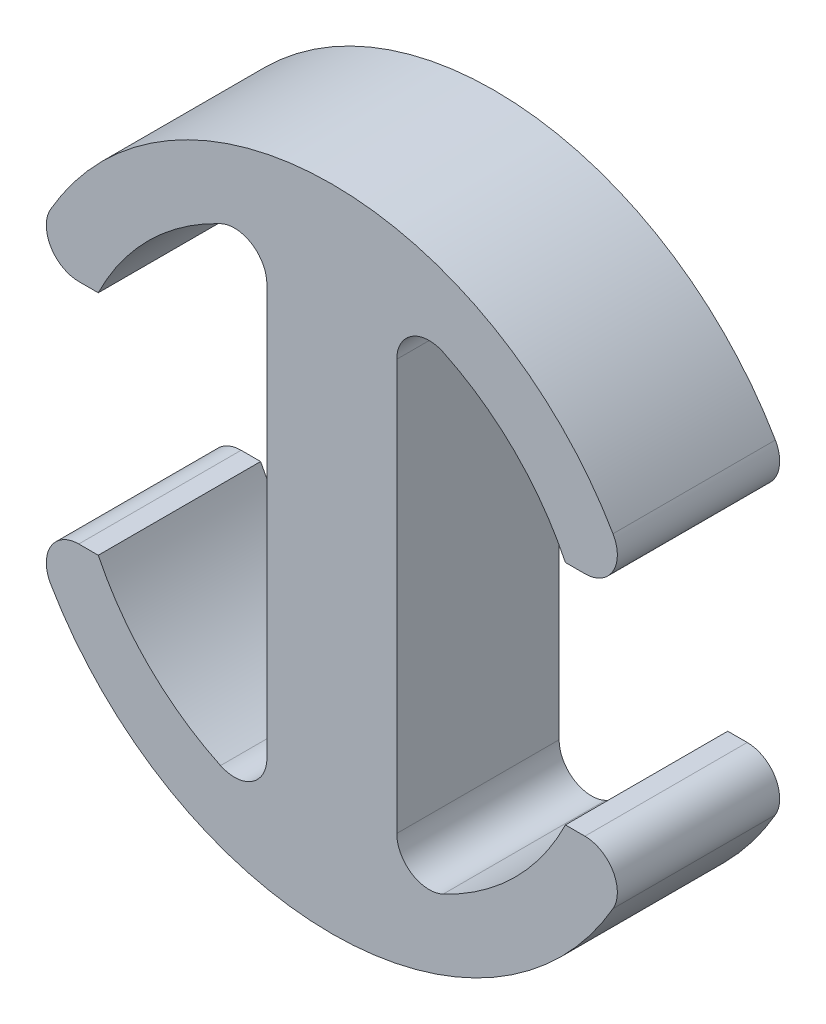
ISO-10303-21;
HEADER;
FILE_DESCRIPTION(('STEP AP214'),'2;1');
FILE_NAME('part.step','',(''),(''),'','','');
FILE_SCHEMA(('AUTOMOTIVE_DESIGN { 1 0 10303 214 1 1 1 1 }'));
ENDSEC;
DATA;
#1=APPLICATION_CONTEXT('core data for automotive mechanical design processes');
#2=APPLICATION_PROTOCOL_DEFINITION('international standard','automotive_design',2000,#1);
#3=PRODUCT_CONTEXT('',#1,'mechanical');
#4=PRODUCT('Part','Part','',(#3));
#5=PRODUCT_RELATED_PRODUCT_CATEGORY('part','',(#4));
#6=PRODUCT_DEFINITION_FORMATION('','',#4);
#7=PRODUCT_DEFINITION_CONTEXT('part definition',#1,'design');
#8=PRODUCT_DEFINITION('design','',#6,#7);
#9=PRODUCT_DEFINITION_SHAPE('','',#8);
#10=(LENGTH_UNIT() NAMED_UNIT(*) SI_UNIT(.MILLI.,.METRE.));
#11=(NAMED_UNIT(*) PLANE_ANGLE_UNIT() SI_UNIT($,.RADIAN.));
#12=(NAMED_UNIT(*) SI_UNIT($,.STERADIAN.) SOLID_ANGLE_UNIT());
#13=UNCERTAINTY_MEASURE_WITH_UNIT(LENGTH_MEASURE(1.E-05),#10,'distance_accuracy_value','');
#14=(GEOMETRIC_REPRESENTATION_CONTEXT(3) GLOBAL_UNCERTAINTY_ASSIGNED_CONTEXT((#13)) GLOBAL_UNIT_ASSIGNED_CONTEXT((#10,
#11,#12)) REPRESENTATION_CONTEXT('',''));
#15=CARTESIAN_POINT('',(0.,0.,0.));
#16=DIRECTION('',(0.,0.,1.));
#17=DIRECTION('',(1.,0.,0.));
#18=AXIS2_PLACEMENT_3D('',#15,#16,#17);
#19=CARTESIAN_POINT('',(-3.,6.32455532033676,5.));
#20=DIRECTION('',(0.,0.,-1.));
#21=DIRECTION('',(-1.,0.,0.));
#22=AXIS2_PLACEMENT_3D('',#19,#20,#21);
#23=CYLINDRICAL_SURFACE('',#22,1.);
#24=CARTESIAN_POINT('',(-3.,6.32455532033676,0.));
#25=DIRECTION('',(0.,0.,1.));
#26=DIRECTION('',(1.,0.,0.));
#27=AXIS2_PLACEMENT_3D('',#24,#25,#26);
#28=CIRCLE('',#27,1.);
#29=CARTESIAN_POINT('',(-2.,6.32455532033676,0.));
#30=VERTEX_POINT('',#29);
#31=CARTESIAN_POINT('',(-3.42857142857143,7.22806322324201,0.));
#32=VERTEX_POINT('',#31);
#33=EDGE_CURVE('E294',#30,#32,#28,.T.);
#34=ORIENTED_EDGE('',*,*,#33,.F.);
#35=DIRECTION('',(0.,0.,-1.));
#36=VECTOR('',#35,1.);
#37=CARTESIAN_POINT('',(-2.,6.32455532033676,5.));
#38=LINE('',#37,#36);
#39=CARTESIAN_POINT('',(-2.,6.32455532033676,5.));
#40=VERTEX_POINT('',#39);
#41=EDGE_CURVE('E12',#40,#30,#38,.T.);
#42=ORIENTED_EDGE('',*,*,#41,.F.);
#43=CARTESIAN_POINT('',(-3.,6.32455532033676,5.));
#44=DIRECTION('',(0.,0.,1.));
#45=DIRECTION('',(1.,0.,0.));
#46=AXIS2_PLACEMENT_3D('',#43,#44,#45);
#47=CIRCLE('',#46,1.);
#48=CARTESIAN_POINT('',(-3.42857142857143,7.22806322324201,5.));
#49=VERTEX_POINT('',#48);
#50=EDGE_CURVE('E286',#40,#49,#47,.T.);
#51=ORIENTED_EDGE('',*,*,#50,.T.);
#52=DIRECTION('',(0.,0.,-1.));
#53=VECTOR('',#52,1.);
#54=CARTESIAN_POINT('',(-3.42857142857143,7.22806322324201,5.));
#55=LINE('',#54,#53);
#56=EDGE_CURVE('E39',#49,#32,#55,.T.);
#57=ORIENTED_EDGE('',*,*,#56,.T.);
#58=EDGE_LOOP('',(#34,#42,#51,#57));
#59=FACE_BOUND('',#58,.T.);
#60=ADVANCED_FACE('F36',(#59),#23,.F.);
#61=CARTESIAN_POINT('',(-2.,-6.32455532033676,5.));
#62=DIRECTION('',(-1.,0.,0.));
#63=DIRECTION('',(0.,0.,1.));
#64=AXIS2_PLACEMENT_3D('',#61,#62,#63);
#65=PLANE('',#64);
#66=DIRECTION('',(0.,1.,0.));
#67=VECTOR('',#66,1.);
#68=CARTESIAN_POINT('',(-2.,-6.32455532033676,0.));
#69=LINE('',#68,#67);
#70=CARTESIAN_POINT('',(-2.,-6.32455532033676,0.));
#71=VERTEX_POINT('',#70);
#72=EDGE_CURVE('E289',#71,#30,#69,.T.);
#73=ORIENTED_EDGE('',*,*,#72,.F.);
#74=DIRECTION('',(0.,0.,-1.));
#75=VECTOR('',#74,1.);
#76=CARTESIAN_POINT('',(-2.,-6.32455532033676,5.));
#77=LINE('',#76,#75);
#78=CARTESIAN_POINT('',(-2.,-6.32455532033676,5.));
#79=VERTEX_POINT('',#78);
#80=EDGE_CURVE('E45',#79,#71,#77,.T.);
#81=ORIENTED_EDGE('',*,*,#80,.F.);
#82=DIRECTION('',(0.,1.,0.));
#83=VECTOR('',#82,1.);
#84=CARTESIAN_POINT('',(-2.,-6.32455532033676,5.));
#85=LINE('',#84,#83);
#86=EDGE_CURVE('E185',#79,#40,#85,.T.);
#87=ORIENTED_EDGE('',*,*,#86,.T.);
#88=ORIENTED_EDGE('',*,*,#41,.T.);
#89=EDGE_LOOP('',(#73,#81,#87,#88));
#90=FACE_BOUND('',#89,.T.);
#91=ADVANCED_FACE('F385',(#90),#65,.T.);
#92=CARTESIAN_POINT('',(-3.,-6.32455532033676,5.));
#93=DIRECTION('',(0.,0.,-1.));
#94=DIRECTION('',(-1.,0.,0.));
#95=AXIS2_PLACEMENT_3D('',#92,#93,#94);
#96=CYLINDRICAL_SURFACE('',#95,1.);
#97=CARTESIAN_POINT('',(-3.,-6.32455532033676,0.));
#98=DIRECTION('',(0.,0.,-1.));
#99=DIRECTION('',(-1.,0.,0.));
#100=AXIS2_PLACEMENT_3D('',#97,#98,#99);
#101=CIRCLE('',#100,1.);
#102=CARTESIAN_POINT('',(-3.42857142857143,-7.22806322324201,0.));
#103=VERTEX_POINT('',#102);
#104=EDGE_CURVE('E190',#71,#103,#101,.T.);
#105=ORIENTED_EDGE('',*,*,#104,.T.);
#106=DIRECTION('',(0.,0.,-1.));
#107=VECTOR('',#106,1.);
#108=CARTESIAN_POINT('',(-3.42857142857143,-7.22806322324201,5.));
#109=LINE('',#108,#107);
#110=CARTESIAN_POINT('',(-3.42857142857143,-7.22806322324201,5.));
#111=VERTEX_POINT('',#110);
#112=EDGE_CURVE('E188',#111,#103,#109,.T.);
#113=ORIENTED_EDGE('',*,*,#112,.F.);
#114=CARTESIAN_POINT('',(-3.,-6.32455532033676,5.));
#115=DIRECTION('',(0.,0.,-1.));
#116=DIRECTION('',(-1.,0.,0.));
#117=AXIS2_PLACEMENT_3D('',#114,#115,#116);
#118=CIRCLE('',#117,1.);
#119=EDGE_CURVE('E180',#79,#111,#118,.T.);
#120=ORIENTED_EDGE('',*,*,#119,.F.);
#121=ORIENTED_EDGE('',*,*,#80,.T.);
#122=EDGE_LOOP('',(#105,#113,#120,#121));
#123=FACE_BOUND('',#122,.T.);
#124=ADVANCED_FACE('F189',(#123),#96,.F.);
#125=CARTESIAN_POINT('',(0.,0.,5.));
#126=DIRECTION('',(0.,0.,-1.));
#127=DIRECTION('',(-1.,0.,0.));
#128=AXIS2_PLACEMENT_3D('',#125,#126,#127);
#129=CYLINDRICAL_SURFACE('',#128,8.);
#130=CARTESIAN_POINT('',(0.,0.,0.));
#131=DIRECTION('',(0.,0.,1.));
#132=DIRECTION('',(1.,0.,0.));
#133=AXIS2_PLACEMENT_3D('',#130,#131,#132);
#134=CIRCLE('',#133,8.);
#135=CARTESIAN_POINT('',(-7.19374728496908,-3.5,0.));
#136=VERTEX_POINT('',#135);
#137=EDGE_CURVE('E341',#136,#103,#134,.T.);
#138=ORIENTED_EDGE('',*,*,#137,.F.);
#139=DIRECTION('',(0.,0.,-1.));
#140=VECTOR('',#139,1.);
#141=CARTESIAN_POINT('',(-7.19374728496908,-3.5,5.));
#142=LINE('',#141,#140);
#143=CARTESIAN_POINT('',(-7.19374728496908,-3.5,5.));
#144=VERTEX_POINT('',#143);
#145=EDGE_CURVE('E194',#144,#136,#142,.T.);
#146=ORIENTED_EDGE('',*,*,#145,.F.);
#147=CARTESIAN_POINT('',(0.,0.,5.));
#148=DIRECTION('',(0.,0.,1.));
#149=DIRECTION('',(1.,0.,0.));
#150=AXIS2_PLACEMENT_3D('',#147,#148,#149);
#151=CIRCLE('',#150,8.);
#152=EDGE_CURVE('E184',#144,#111,#151,.T.);
#153=ORIENTED_EDGE('',*,*,#152,.T.);
#154=ORIENTED_EDGE('',*,*,#112,.T.);
#155=EDGE_LOOP('',(#138,#146,#153,#154));
#156=FACE_BOUND('',#155,.T.);
#157=ADVANCED_FACE('F196',(#156),#129,.F.);
#158=CARTESIAN_POINT('',(-7.19374728496908,-3.5,5.));
#159=DIRECTION('',(0.,-1.,0.));
#160=DIRECTION('',(1.,0.,0.));
#161=AXIS2_PLACEMENT_3D('',#158,#159,#160);
#162=PLANE('',#161);
#163=DIRECTION('',(-1.,0.,0.));
#164=VECTOR('',#163,1.);
#165=CARTESIAN_POINT('',(-7.19374728496908,-3.5,0.));
#166=LINE('',#165,#164);
#167=CARTESIAN_POINT('',(-7.79422863405995,-3.5,0.));
#168=VERTEX_POINT('',#167);
#169=EDGE_CURVE('E339',#136,#168,#166,.T.);
#170=ORIENTED_EDGE('',*,*,#169,.T.);
#171=DIRECTION('',(0.,0.,-1.));
#172=VECTOR('',#171,1.);
#173=CARTESIAN_POINT('',(-7.79422863405995,-3.5,5.));
#174=LINE('',#173,#172);
#175=CARTESIAN_POINT('',(-7.79422863405995,-3.5,5.));
#176=VERTEX_POINT('',#175);
#177=EDGE_CURVE('E348',#176,#168,#174,.T.);
#178=ORIENTED_EDGE('',*,*,#177,.F.);
#179=DIRECTION('',(-1.,0.,0.));
#180=VECTOR('',#179,1.);
#181=CARTESIAN_POINT('',(-7.19374728496908,-3.5,5.));
#182=LINE('',#181,#180);
#183=EDGE_CURVE('E199',#144,#176,#182,.T.);
#184=ORIENTED_EDGE('',*,*,#183,.F.);
#185=ORIENTED_EDGE('',*,*,#145,.T.);
#186=EDGE_LOOP('',(#170,#178,#184,#185));
#187=FACE_BOUND('',#186,.T.);
#188=ADVANCED_FACE('F398',(#187),#162,.F.);
#189=CARTESIAN_POINT('',(-7.79422863405995,-4.5,5.));
#190=DIRECTION('',(0.,0.,-1.));
#191=DIRECTION('',(-1.,0.,0.));
#192=AXIS2_PLACEMENT_3D('',#189,#190,#191);
#193=CYLINDRICAL_SURFACE('',#192,1.);
#194=CARTESIAN_POINT('',(-7.79422863405995,-4.5,0.));
#195=DIRECTION('',(0.,0.,1.));
#196=DIRECTION('',(1.,0.,0.));
#197=AXIS2_PLACEMENT_3D('',#194,#195,#196);
#198=CIRCLE('',#197,1.);
#199=CARTESIAN_POINT('',(-8.66025403784439,-5.,0.));
#200=VERTEX_POINT('',#199);
#201=EDGE_CURVE('E337',#168,#200,#198,.T.);
#202=ORIENTED_EDGE('',*,*,#201,.T.);
#203=DIRECTION('',(0.,0.,-1.));
#204=VECTOR('',#203,1.);
#205=CARTESIAN_POINT('',(-8.66025403784439,-5.,5.));
#206=LINE('',#205,#204);
#207=CARTESIAN_POINT('',(-8.66025403784439,-5.,5.));
#208=VERTEX_POINT('',#207);
#209=EDGE_CURVE('E351',#208,#200,#206,.T.);
#210=ORIENTED_EDGE('',*,*,#209,.F.);
#211=CARTESIAN_POINT('',(-7.79422863405995,-4.5,5.));
#212=DIRECTION('',(0.,0.,1.));
#213=DIRECTION('',(1.,0.,0.));
#214=AXIS2_PLACEMENT_3D('',#211,#212,#213);
#215=CIRCLE('',#214,1.);
#216=EDGE_CURVE('E202',#176,#208,#215,.T.);
#217=ORIENTED_EDGE('',*,*,#216,.F.);
#218=ORIENTED_EDGE('',*,*,#177,.T.);
#219=EDGE_LOOP('',(#202,#210,#217,#218));
#220=FACE_BOUND('',#219,.T.);
#221=ADVANCED_FACE('F401',(#220),#193,.T.);
#222=CARTESIAN_POINT('',(0.,0.,5.));
#223=DIRECTION('',(0.,0.,-1.));
#224=DIRECTION('',(-1.,0.,0.));
#225=AXIS2_PLACEMENT_3D('',#222,#223,#224);
#226=CYLINDRICAL_SURFACE('',#225,10.);
#227=CARTESIAN_POINT('',(0.,0.,0.));
#228=DIRECTION('',(0.,0.,1.));
#229=DIRECTION('',(1.,0.,0.));
#230=AXIS2_PLACEMENT_3D('',#227,#228,#229);
#231=CIRCLE('',#230,10.);
#232=CARTESIAN_POINT('',(8.66025403784439,-5.,0.));
#233=VERTEX_POINT('',#232);
#234=EDGE_CURVE('E335',#200,#233,#231,.T.);
#235=ORIENTED_EDGE('',*,*,#234,.T.);
#236=DIRECTION('',(0.,0.,-1.));
#237=VECTOR('',#236,1.);
#238=CARTESIAN_POINT('',(8.66025403784439,-5.,5.));
#239=LINE('',#238,#237);
#240=CARTESIAN_POINT('',(8.66025403784439,-5.,5.));
#241=VERTEX_POINT('',#240);
#242=EDGE_CURVE('E354',#241,#233,#239,.T.);
#243=ORIENTED_EDGE('',*,*,#242,.F.);
#244=CARTESIAN_POINT('',(0.,0.,5.));
#245=DIRECTION('',(0.,0.,1.));
#246=DIRECTION('',(1.,0.,0.));
#247=AXIS2_PLACEMENT_3D('',#244,#245,#246);
#248=CIRCLE('',#247,10.);
#249=EDGE_CURVE('E219',#208,#241,#248,.T.);
#250=ORIENTED_EDGE('',*,*,#249,.F.);
#251=ORIENTED_EDGE('',*,*,#209,.T.);
#252=EDGE_LOOP('',(#235,#243,#250,#251));
#253=FACE_BOUND('',#252,.T.);
#254=ADVANCED_FACE('F405',(#253),#226,.T.);
#255=CARTESIAN_POINT('',(7.79422863405995,-4.5,5.));
#256=DIRECTION('',(0.,0.,-1.));
#257=DIRECTION('',(-1.,0.,0.));
#258=AXIS2_PLACEMENT_3D('',#255,#256,#257);
#259=CYLINDRICAL_SURFACE('',#258,0.999999999999999);
#260=CARTESIAN_POINT('',(7.79422863405995,-4.5,0.));
#261=DIRECTION('',(0.,0.,1.));
#262=DIRECTION('',(1.,0.,0.));
#263=AXIS2_PLACEMENT_3D('',#260,#261,#262);
#264=CIRCLE('',#263,0.999999999999999);
#265=CARTESIAN_POINT('',(7.79422863405995,-3.5,0.));
#266=VERTEX_POINT('',#265);
#267=EDGE_CURVE('E332',#233,#266,#264,.T.);
#268=ORIENTED_EDGE('',*,*,#267,.T.);
#269=DIRECTION('',(0.,0.,-1.));
#270=VECTOR('',#269,1.);
#271=CARTESIAN_POINT('',(7.79422863405995,-3.5,5.));
#272=LINE('',#271,#270);
#273=CARTESIAN_POINT('',(7.79422863405995,-3.5,5.));
#274=VERTEX_POINT('',#273);
#275=EDGE_CURVE('E357',#274,#266,#272,.T.);
#276=ORIENTED_EDGE('',*,*,#275,.F.);
#277=CARTESIAN_POINT('',(7.79422863405995,-4.5,5.));
#278=DIRECTION('',(0.,0.,1.));
#279=DIRECTION('',(1.,0.,0.));
#280=AXIS2_PLACEMENT_3D('',#277,#278,#279);
#281=CIRCLE('',#280,0.999999999999999);
#282=EDGE_CURVE('E223',#241,#274,#281,.T.);
#283=ORIENTED_EDGE('',*,*,#282,.F.);
#284=ORIENTED_EDGE('',*,*,#242,.T.);
#285=EDGE_LOOP('',(#268,#276,#283,#284));
#286=FACE_BOUND('',#285,.T.);
#287=ADVANCED_FACE('F409',(#286),#259,.T.);
#288=CARTESIAN_POINT('',(7.19374728496908,-3.5,5.));
#289=DIRECTION('',(0.,1.,0.));
#290=DIRECTION('',(-1.,0.,0.));
#291=AXIS2_PLACEMENT_3D('',#288,#289,#290);
#292=PLANE('',#291);
#293=DIRECTION('',(1.,0.,0.));
#294=VECTOR('',#293,1.);
#295=CARTESIAN_POINT('',(7.19374728496908,-3.5,0.));
#296=LINE('',#295,#294);
#297=CARTESIAN_POINT('',(7.19374728496908,-3.5,0.));
#298=VERTEX_POINT('',#297);
#299=EDGE_CURVE('E329',#298,#266,#296,.T.);
#300=ORIENTED_EDGE('',*,*,#299,.F.);
#301=DIRECTION('',(0.,0.,-1.));
#302=VECTOR('',#301,1.);
#303=CARTESIAN_POINT('',(7.19374728496908,-3.5,5.));
#304=LINE('',#303,#302);
#305=CARTESIAN_POINT('',(7.19374728496908,-3.5,5.));
#306=VERTEX_POINT('',#305);
#307=EDGE_CURVE('E359',#306,#298,#304,.T.);
#308=ORIENTED_EDGE('',*,*,#307,.F.);
#309=DIRECTION('',(1.,0.,0.));
#310=VECTOR('',#309,1.);
#311=CARTESIAN_POINT('',(7.19374728496908,-3.5,5.));
#312=LINE('',#311,#310);
#313=EDGE_CURVE('E227',#306,#274,#312,.T.);
#314=ORIENTED_EDGE('',*,*,#313,.T.);
#315=ORIENTED_EDGE('',*,*,#275,.T.);
#316=EDGE_LOOP('',(#300,#308,#314,#315));
#317=FACE_BOUND('',#316,.T.);
#318=ADVANCED_FACE('F413',(#317),#292,.T.);
#319=CARTESIAN_POINT('',(0.,0.,5.));
#320=DIRECTION('',(0.,0.,-1.));
#321=DIRECTION('',(-1.,0.,0.));
#322=AXIS2_PLACEMENT_3D('',#319,#320,#321);
#323=CYLINDRICAL_SURFACE('',#322,8.);
#324=CARTESIAN_POINT('',(0.,0.,0.));
#325=DIRECTION('',(0.,0.,1.));
#326=DIRECTION('',(1.,0.,0.));
#327=AXIS2_PLACEMENT_3D('',#324,#325,#326);
#328=CIRCLE('',#327,8.);
#329=CARTESIAN_POINT('',(3.42857142857143,-7.22806322324201,0.));
#330=VERTEX_POINT('',#329);
#331=EDGE_CURVE('E326',#330,#298,#328,.T.);
#332=ORIENTED_EDGE('',*,*,#331,.F.);
#333=DIRECTION('',(0.,0.,-1.));
#334=VECTOR('',#333,1.);
#335=CARTESIAN_POINT('',(3.42857142857143,-7.22806322324201,5.));
#336=LINE('',#335,#334);
#337=CARTESIAN_POINT('',(3.42857142857143,-7.22806322324201,5.));
#338=VERTEX_POINT('',#337);
#339=EDGE_CURVE('E361',#338,#330,#336,.T.);
#340=ORIENTED_EDGE('',*,*,#339,.F.);
#341=CARTESIAN_POINT('',(0.,0.,5.));
#342=DIRECTION('',(0.,0.,1.));
#343=DIRECTION('',(1.,0.,0.));
#344=AXIS2_PLACEMENT_3D('',#341,#342,#343);
#345=CIRCLE('',#344,8.);
#346=EDGE_CURVE('E235',#338,#306,#345,.T.);
#347=ORIENTED_EDGE('',*,*,#346,.T.);
#348=ORIENTED_EDGE('',*,*,#307,.T.);
#349=EDGE_LOOP('',(#332,#340,#347,#348));
#350=FACE_BOUND('',#349,.T.);
#351=ADVANCED_FACE('F417',(#350),#323,.F.);
#352=CARTESIAN_POINT('',(3.,-6.32455532033676,5.));
#353=DIRECTION('',(0.,0.,-1.));
#354=DIRECTION('',(-1.,0.,0.));
#355=AXIS2_PLACEMENT_3D('',#352,#353,#354);
#356=CYLINDRICAL_SURFACE('',#355,1.);
#357=CARTESIAN_POINT('',(3.,-6.32455532033676,0.));
#358=DIRECTION('',(0.,0.,-1.));
#359=DIRECTION('',(-1.,0.,0.));
#360=AXIS2_PLACEMENT_3D('',#357,#358,#359);
#361=CIRCLE('',#360,1.);
#362=CARTESIAN_POINT('',(2.,-6.32455532033676,0.));
#363=VERTEX_POINT('',#362);
#364=EDGE_CURVE('E324',#330,#363,#361,.T.);
#365=ORIENTED_EDGE('',*,*,#364,.T.);
#366=DIRECTION('',(0.,0.,-1.));
#367=VECTOR('',#366,1.);
#368=CARTESIAN_POINT('',(2.,-6.32455532033676,5.));
#369=LINE('',#368,#367);
#370=CARTESIAN_POINT('',(2.,-6.32455532033676,5.));
#371=VERTEX_POINT('',#370);
#372=EDGE_CURVE('E363',#371,#363,#369,.T.);
#373=ORIENTED_EDGE('',*,*,#372,.F.);
#374=CARTESIAN_POINT('',(3.,-6.32455532033676,5.));
#375=DIRECTION('',(0.,0.,-1.));
#376=DIRECTION('',(-1.,0.,0.));
#377=AXIS2_PLACEMENT_3D('',#374,#375,#376);
#378=CIRCLE('',#377,1.);
#379=EDGE_CURVE('E239',#338,#371,#378,.T.);
#380=ORIENTED_EDGE('',*,*,#379,.F.);
#381=ORIENTED_EDGE('',*,*,#339,.T.);
#382=EDGE_LOOP('',(#365,#373,#380,#381));
#383=FACE_BOUND('',#382,.T.);
#384=ADVANCED_FACE('F421',(#383),#356,.F.);
#385=CARTESIAN_POINT('',(2.,-6.32455532033676,5.));
#386=DIRECTION('',(-1.,0.,0.));
#387=DIRECTION('',(0.,0.,1.));
#388=AXIS2_PLACEMENT_3D('',#385,#386,#387);
#389=PLANE('',#388);
#390=DIRECTION('',(0.,1.,0.));
#391=VECTOR('',#390,1.);
#392=CARTESIAN_POINT('',(2.,-6.32455532033676,0.));
#393=LINE('',#392,#391);
#394=CARTESIAN_POINT('',(2.,6.32455532033676,0.));
#395=VERTEX_POINT('',#394);
#396=EDGE_CURVE('E321',#363,#395,#393,.T.);
#397=ORIENTED_EDGE('',*,*,#396,.T.);
#398=DIRECTION('',(0.,0.,-1.));
#399=VECTOR('',#398,1.);
#400=CARTESIAN_POINT('',(2.,6.32455532033676,5.));
#401=LINE('',#400,#399);
#402=CARTESIAN_POINT('',(2.,6.32455532033676,5.));
#403=VERTEX_POINT('',#402);
#404=EDGE_CURVE('E366',#403,#395,#401,.T.);
#405=ORIENTED_EDGE('',*,*,#404,.F.);
#406=DIRECTION('',(0.,1.,0.));
#407=VECTOR('',#406,1.);
#408=CARTESIAN_POINT('',(2.,-6.32455532033676,5.));
#409=LINE('',#408,#407);
#410=EDGE_CURVE('E243',#371,#403,#409,.T.);
#411=ORIENTED_EDGE('',*,*,#410,.F.);
#412=ORIENTED_EDGE('',*,*,#372,.T.);
#413=EDGE_LOOP('',(#397,#405,#411,#412));
#414=FACE_BOUND('',#413,.T.);
#415=ADVANCED_FACE('F425',(#414),#389,.F.);
#416=CARTESIAN_POINT('',(3.,6.32455532033676,5.));
#417=DIRECTION('',(0.,0.,-1.));
#418=DIRECTION('',(-1.,0.,0.));
#419=AXIS2_PLACEMENT_3D('',#416,#417,#418);
#420=CYLINDRICAL_SURFACE('',#419,1.);
#421=CARTESIAN_POINT('',(3.,6.32455532033676,0.));
#422=DIRECTION('',(0.,0.,1.));
#423=DIRECTION('',(1.,0.,0.));
#424=AXIS2_PLACEMENT_3D('',#421,#422,#423);
#425=CIRCLE('',#424,1.);
#426=CARTESIAN_POINT('',(3.42857142857143,7.22806322324201,0.));
#427=VERTEX_POINT('',#426);
#428=EDGE_CURVE('E318',#427,#395,#425,.T.);
#429=ORIENTED_EDGE('',*,*,#428,.F.);
#430=DIRECTION('',(0.,0.,-1.));
#431=VECTOR('',#430,1.);
#432=CARTESIAN_POINT('',(3.42857142857143,7.22806322324201,5.));
#433=LINE('',#432,#431);
#434=CARTESIAN_POINT('',(3.42857142857143,7.22806322324201,5.));
#435=VERTEX_POINT('',#434);
#436=EDGE_CURVE('E368',#435,#427,#433,.T.);
#437=ORIENTED_EDGE('',*,*,#436,.F.);
#438=CARTESIAN_POINT('',(3.,6.32455532033676,5.));
#439=DIRECTION('',(0.,0.,1.));
#440=DIRECTION('',(1.,0.,0.));
#441=AXIS2_PLACEMENT_3D('',#438,#439,#440);
#442=CIRCLE('',#441,1.);
#443=EDGE_CURVE('E247',#435,#403,#442,.T.);
#444=ORIENTED_EDGE('',*,*,#443,.T.);
#445=ORIENTED_EDGE('',*,*,#404,.T.);
#446=EDGE_LOOP('',(#429,#437,#444,#445));
#447=FACE_BOUND('',#446,.T.);
#448=ADVANCED_FACE('F429',(#447),#420,.F.);
#449=CARTESIAN_POINT('',(0.,0.,5.));
#450=DIRECTION('',(0.,0.,-1.));
#451=DIRECTION('',(-1.,0.,0.));
#452=AXIS2_PLACEMENT_3D('',#449,#450,#451);
#453=CYLINDRICAL_SURFACE('',#452,8.);
#454=CARTESIAN_POINT('',(0.,0.,0.));
#455=DIRECTION('',(0.,0.,1.));
#456=DIRECTION('',(1.,0.,0.));
#457=AXIS2_PLACEMENT_3D('',#454,#455,#456);
#458=CIRCLE('',#457,8.);
#459=CARTESIAN_POINT('',(7.19374728496908,3.5,0.));
#460=VERTEX_POINT('',#459);
#461=EDGE_CURVE('E315',#460,#427,#458,.T.);
#462=ORIENTED_EDGE('',*,*,#461,.F.);
#463=DIRECTION('',(0.,0.,-1.));
#464=VECTOR('',#463,1.);
#465=CARTESIAN_POINT('',(7.19374728496908,3.5,5.));
#466=LINE('',#465,#464);
#467=CARTESIAN_POINT('',(7.19374728496908,3.5,5.));
#468=VERTEX_POINT('',#467);
#469=EDGE_CURVE('E370',#468,#460,#466,.T.);
#470=ORIENTED_EDGE('',*,*,#469,.F.);
#471=CARTESIAN_POINT('',(0.,0.,5.));
#472=DIRECTION('',(0.,0.,1.));
#473=DIRECTION('',(1.,0.,0.));
#474=AXIS2_PLACEMENT_3D('',#471,#472,#473);
#475=CIRCLE('',#474,8.);
#476=EDGE_CURVE('E255',#468,#435,#475,.T.);
#477=ORIENTED_EDGE('',*,*,#476,.T.);
#478=ORIENTED_EDGE('',*,*,#436,.T.);
#479=EDGE_LOOP('',(#462,#470,#477,#478));
#480=FACE_BOUND('',#479,.T.);
#481=ADVANCED_FACE('F433',(#480),#453,.F.);
#482=CARTESIAN_POINT('',(7.79422863405995,3.5,5.));
#483=DIRECTION('',(0.,-1.,0.));
#484=DIRECTION('',(1.,0.,0.));
#485=AXIS2_PLACEMENT_3D('',#482,#483,#484);
#486=PLANE('',#485);
#487=DIRECTION('',(-1.,0.,0.));
#488=VECTOR('',#487,1.);
#489=CARTESIAN_POINT('',(7.79422863405995,3.5,0.));
#490=LINE('',#489,#488);
#491=CARTESIAN_POINT('',(7.79422863405995,3.5,0.));
#492=VERTEX_POINT('',#491);
#493=EDGE_CURVE('E312',#492,#460,#490,.T.);
#494=ORIENTED_EDGE('',*,*,#493,.F.);
#495=DIRECTION('',(0.,0.,-1.));
#496=VECTOR('',#495,1.);
#497=CARTESIAN_POINT('',(7.79422863405995,3.5,5.));
#498=LINE('',#497,#496);
#499=CARTESIAN_POINT('',(7.79422863405995,3.5,5.));
#500=VERTEX_POINT('',#499);
#501=EDGE_CURVE('E372',#500,#492,#498,.T.);
#502=ORIENTED_EDGE('',*,*,#501,.F.);
#503=DIRECTION('',(-1.,0.,0.));
#504=VECTOR('',#503,1.);
#505=CARTESIAN_POINT('',(7.79422863405995,3.5,5.));
#506=LINE('',#505,#504);
#507=EDGE_CURVE('E259',#500,#468,#506,.T.);
#508=ORIENTED_EDGE('',*,*,#507,.T.);
#509=ORIENTED_EDGE('',*,*,#469,.T.);
#510=EDGE_LOOP('',(#494,#502,#508,#509));
#511=FACE_BOUND('',#510,.T.);
#512=ADVANCED_FACE('F437',(#511),#486,.T.);
#513=CARTESIAN_POINT('',(7.79422863405995,4.5,5.));
#514=DIRECTION('',(0.,0.,-1.));
#515=DIRECTION('',(-1.,0.,0.));
#516=AXIS2_PLACEMENT_3D('',#513,#514,#515);
#517=CYLINDRICAL_SURFACE('',#516,0.999999999999999);
#518=CARTESIAN_POINT('',(7.79422863405995,4.5,0.));
#519=DIRECTION('',(0.,0.,-1.));
#520=DIRECTION('',(-1.,0.,0.));
#521=AXIS2_PLACEMENT_3D('',#518,#519,#520);
#522=CIRCLE('',#521,0.999999999999999);
#523=CARTESIAN_POINT('',(8.66025403784439,5.,0.));
#524=VERTEX_POINT('',#523);
#525=EDGE_CURVE('E309',#524,#492,#522,.T.);
#526=ORIENTED_EDGE('',*,*,#525,.F.);
#527=DIRECTION('',(0.,0.,-1.));
#528=VECTOR('',#527,1.);
#529=CARTESIAN_POINT('',(8.66025403784439,5.,5.));
#530=LINE('',#529,#528);
#531=CARTESIAN_POINT('',(8.66025403784439,5.,5.));
#532=VERTEX_POINT('',#531);
#533=EDGE_CURVE('E374',#532,#524,#530,.T.);
#534=ORIENTED_EDGE('',*,*,#533,.F.);
#535=CARTESIAN_POINT('',(7.79422863405995,4.5,5.));
#536=DIRECTION('',(0.,0.,-1.));
#537=DIRECTION('',(-1.,0.,0.));
#538=AXIS2_PLACEMENT_3D('',#535,#536,#537);
#539=CIRCLE('',#538,0.999999999999999);
#540=EDGE_CURVE('E264',#532,#500,#539,.T.);
#541=ORIENTED_EDGE('',*,*,#540,.T.);
#542=ORIENTED_EDGE('',*,*,#501,.T.);
#543=EDGE_LOOP('',(#526,#534,#541,#542));
#544=FACE_BOUND('',#543,.T.);
#545=ADVANCED_FACE('F441',(#544),#517,.T.);
#546=CARTESIAN_POINT('',(0.,0.,5.));
#547=DIRECTION('',(0.,0.,-1.));
#548=DIRECTION('',(-1.,0.,0.));
#549=AXIS2_PLACEMENT_3D('',#546,#547,#548);
#550=CYLINDRICAL_SURFACE('',#549,10.);
#551=CARTESIAN_POINT('',(0.,0.,0.));
#552=DIRECTION('',(0.,0.,1.));
#553=DIRECTION('',(1.,0.,0.));
#554=AXIS2_PLACEMENT_3D('',#551,#552,#553);
#555=CIRCLE('',#554,10.);
#556=CARTESIAN_POINT('',(-8.66025403784439,5.,0.));
#557=VERTEX_POINT('',#556);
#558=EDGE_CURVE('E306',#524,#557,#555,.T.);
#559=ORIENTED_EDGE('',*,*,#558,.T.);
#560=DIRECTION('',(0.,0.,-1.));
#561=VECTOR('',#560,1.);
#562=CARTESIAN_POINT('',(-8.66025403784439,5.,5.));
#563=LINE('',#562,#561);
#564=CARTESIAN_POINT('',(-8.66025403784439,5.,5.));
#565=VERTEX_POINT('',#564);
#566=EDGE_CURVE('E376',#565,#557,#563,.T.);
#567=ORIENTED_EDGE('',*,*,#566,.F.);
#568=CARTESIAN_POINT('',(0.,0.,5.));
#569=DIRECTION('',(0.,0.,1.));
#570=DIRECTION('',(1.,0.,0.));
#571=AXIS2_PLACEMENT_3D('',#568,#569,#570);
#572=CIRCLE('',#571,10.);
#573=EDGE_CURVE('E269',#532,#565,#572,.T.);
#574=ORIENTED_EDGE('',*,*,#573,.F.);
#575=ORIENTED_EDGE('',*,*,#533,.T.);
#576=EDGE_LOOP('',(#559,#567,#574,#575));
#577=FACE_BOUND('',#576,.T.);
#578=ADVANCED_FACE('F445',(#577),#550,.T.);
#579=CARTESIAN_POINT('',(-7.79422863405995,4.5,5.));
#580=DIRECTION('',(0.,0.,-1.));
#581=DIRECTION('',(-1.,0.,0.));
#582=AXIS2_PLACEMENT_3D('',#579,#580,#581);
#583=CYLINDRICAL_SURFACE('',#582,1.);
#584=CARTESIAN_POINT('',(-7.79422863405995,4.5,0.));
#585=DIRECTION('',(0.,0.,-1.));
#586=DIRECTION('',(-1.,0.,0.));
#587=AXIS2_PLACEMENT_3D('',#584,#585,#586);
#588=CIRCLE('',#587,1.);
#589=CARTESIAN_POINT('',(-7.79422863405995,3.5,0.));
#590=VERTEX_POINT('',#589);
#591=EDGE_CURVE('E303',#590,#557,#588,.T.);
#592=ORIENTED_EDGE('',*,*,#591,.F.);
#593=DIRECTION('',(0.,0.,-1.));
#594=VECTOR('',#593,1.);
#595=CARTESIAN_POINT('',(-7.79422863405995,3.5,5.));
#596=LINE('',#595,#594);
#597=CARTESIAN_POINT('',(-7.79422863405995,3.5,5.));
#598=VERTEX_POINT('',#597);
#599=EDGE_CURVE('E378',#598,#590,#596,.T.);
#600=ORIENTED_EDGE('',*,*,#599,.F.);
#601=CARTESIAN_POINT('',(-7.79422863405995,4.5,5.));
#602=DIRECTION('',(0.,0.,-1.));
#603=DIRECTION('',(-1.,0.,0.));
#604=AXIS2_PLACEMENT_3D('',#601,#602,#603);
#605=CIRCLE('',#604,1.);
#606=EDGE_CURVE('E275',#598,#565,#605,.T.);
#607=ORIENTED_EDGE('',*,*,#606,.T.);
#608=ORIENTED_EDGE('',*,*,#566,.T.);
#609=EDGE_LOOP('',(#592,#600,#607,#608));
#610=FACE_BOUND('',#609,.T.);
#611=ADVANCED_FACE('F449',(#610),#583,.T.);
#612=CARTESIAN_POINT('',(-7.79422863405995,3.5,5.));
#613=DIRECTION('',(0.,1.,0.));
#614=DIRECTION('',(-1.,0.,0.));
#615=AXIS2_PLACEMENT_3D('',#612,#613,#614);
#616=PLANE('',#615);
#617=DIRECTION('',(1.,0.,0.));
#618=VECTOR('',#617,1.);
#619=CARTESIAN_POINT('',(-7.79422863405995,3.5,0.));
#620=LINE('',#619,#618);
#621=CARTESIAN_POINT('',(-7.19374728496908,3.5,0.));
#622=VERTEX_POINT('',#621);
#623=EDGE_CURVE('E300',#590,#622,#620,.T.);
#624=ORIENTED_EDGE('',*,*,#623,.T.);
#625=DIRECTION('',(0.,0.,-1.));
#626=VECTOR('',#625,1.);
#627=CARTESIAN_POINT('',(-7.19374728496908,3.5,5.));
#628=LINE('',#627,#626);
#629=CARTESIAN_POINT('',(-7.19374728496908,3.5,5.));
#630=VERTEX_POINT('',#629);
#631=EDGE_CURVE('E379',#630,#622,#628,.T.);
#632=ORIENTED_EDGE('',*,*,#631,.F.);
#633=DIRECTION('',(1.,0.,0.));
#634=VECTOR('',#633,1.);
#635=CARTESIAN_POINT('',(-7.79422863405995,3.5,5.));
#636=LINE('',#635,#634);
#637=EDGE_CURVE('E279',#598,#630,#636,.T.);
#638=ORIENTED_EDGE('',*,*,#637,.F.);
#639=ORIENTED_EDGE('',*,*,#599,.T.);
#640=EDGE_LOOP('',(#624,#632,#638,#639));
#641=FACE_BOUND('',#640,.T.);
#642=ADVANCED_FACE('F453',(#641),#616,.F.);
#643=CARTESIAN_POINT('',(0.,0.,5.));
#644=DIRECTION('',(0.,0.,-1.));
#645=DIRECTION('',(-1.,0.,0.));
#646=AXIS2_PLACEMENT_3D('',#643,#644,#645);
#647=CYLINDRICAL_SURFACE('',#646,8.);
#648=CARTESIAN_POINT('',(0.,0.,0.));
#649=DIRECTION('',(0.,0.,1.));
#650=DIRECTION('',(1.,0.,0.));
#651=AXIS2_PLACEMENT_3D('',#648,#649,#650);
#652=CIRCLE('',#651,8.);
#653=EDGE_CURVE('E297',#32,#622,#652,.T.);
#654=ORIENTED_EDGE('',*,*,#653,.F.);
#655=ORIENTED_EDGE('',*,*,#56,.F.);
#656=CARTESIAN_POINT('',(0.,0.,5.));
#657=DIRECTION('',(0.,0.,1.));
#658=DIRECTION('',(1.,0.,0.));
#659=AXIS2_PLACEMENT_3D('',#656,#657,#658);
#660=CIRCLE('',#659,8.);
#661=EDGE_CURVE('E282',#49,#630,#660,.T.);
#662=ORIENTED_EDGE('',*,*,#661,.T.);
#663=ORIENTED_EDGE('',*,*,#631,.T.);
#664=EDGE_LOOP('',(#654,#655,#662,#663));
#665=FACE_BOUND('',#664,.T.);
#666=ADVANCED_FACE('F381',(#665),#647,.F.);
#667=CARTESIAN_POINT('',(-3.,6.32455532033676,5.));
#668=DIRECTION('',(0.,0.,1.));
#669=DIRECTION('',(1.,0.,0.));
#670=AXIS2_PLACEMENT_3D('',#667,#668,#669);
#671=PLANE('',#670);
#672=ORIENTED_EDGE('',*,*,#50,.F.);
#673=ORIENTED_EDGE('',*,*,#86,.F.);
#674=ORIENTED_EDGE('',*,*,#119,.T.);
#675=ORIENTED_EDGE('',*,*,#152,.F.);
#676=ORIENTED_EDGE('',*,*,#183,.T.);
#677=ORIENTED_EDGE('',*,*,#216,.T.);
#678=ORIENTED_EDGE('',*,*,#249,.T.);
#679=ORIENTED_EDGE('',*,*,#282,.T.);
#680=ORIENTED_EDGE('',*,*,#313,.F.);
#681=ORIENTED_EDGE('',*,*,#346,.F.);
#682=ORIENTED_EDGE('',*,*,#379,.T.);
#683=ORIENTED_EDGE('',*,*,#410,.T.);
#684=ORIENTED_EDGE('',*,*,#443,.F.);
#685=ORIENTED_EDGE('',*,*,#476,.F.);
#686=ORIENTED_EDGE('',*,*,#507,.F.);
#687=ORIENTED_EDGE('',*,*,#540,.F.);
#688=ORIENTED_EDGE('',*,*,#573,.T.);
#689=ORIENTED_EDGE('',*,*,#606,.F.);
#690=ORIENTED_EDGE('',*,*,#637,.T.);
#691=ORIENTED_EDGE('',*,*,#661,.F.);
#692=EDGE_LOOP('',(#672,#673,#674,#675,#676,#677,#678,#679,#680,#681,#682,#683,#684,#685,#686,
#687,#688,#689,#690,#691));
#693=FACE_BOUND('',#692,.T.);
#694=ADVANCED_FACE('F182',(#693),#671,.T.);
#695=CARTESIAN_POINT('',(-3.,6.32455532033676,0.));
#696=DIRECTION('',(0.,0.,1.));
#697=DIRECTION('',(1.,0.,0.));
#698=AXIS2_PLACEMENT_3D('',#695,#696,#697);
#699=PLANE('',#698);
#700=ORIENTED_EDGE('',*,*,#33,.T.);
#701=ORIENTED_EDGE('',*,*,#653,.T.);
#702=ORIENTED_EDGE('',*,*,#623,.F.);
#703=ORIENTED_EDGE('',*,*,#591,.T.);
#704=ORIENTED_EDGE('',*,*,#558,.F.);
#705=ORIENTED_EDGE('',*,*,#525,.T.);
#706=ORIENTED_EDGE('',*,*,#493,.T.);
#707=ORIENTED_EDGE('',*,*,#461,.T.);
#708=ORIENTED_EDGE('',*,*,#428,.T.);
#709=ORIENTED_EDGE('',*,*,#396,.F.);
#710=ORIENTED_EDGE('',*,*,#364,.F.);
#711=ORIENTED_EDGE('',*,*,#331,.T.);
#712=ORIENTED_EDGE('',*,*,#299,.T.);
#713=ORIENTED_EDGE('',*,*,#267,.F.);
#714=ORIENTED_EDGE('',*,*,#234,.F.);
#715=ORIENTED_EDGE('',*,*,#201,.F.);
#716=ORIENTED_EDGE('',*,*,#169,.F.);
#717=ORIENTED_EDGE('',*,*,#137,.T.);
#718=ORIENTED_EDGE('',*,*,#104,.F.);
#719=ORIENTED_EDGE('',*,*,#72,.T.);
#720=EDGE_LOOP('',(#700,#701,#702,#703,#704,#705,#706,#707,#708,#709,#710,#711,#712,#713,#714,
#715,#716,#717,#718,#719));
#721=FACE_BOUND('',#720,.T.);
#722=ADVANCED_FACE('F384',(#721),#699,.F.);
#723=CLOSED_SHELL('',(#60,#91,#124,#157,#188,#221,#254,#287,#318,#351,#384,#415,#448,#481,#512,
#545,#578,#611,#642,#666,#694,#722));
#724=MANIFOLD_SOLID_BREP('B2',#723);
#725=ADVANCED_BREP_SHAPE_REPRESENTATION('',(#18,#724),#14);
#726=SHAPE_DEFINITION_REPRESENTATION(#9,#725);
ENDSEC;
END-ISO-10303-21;
